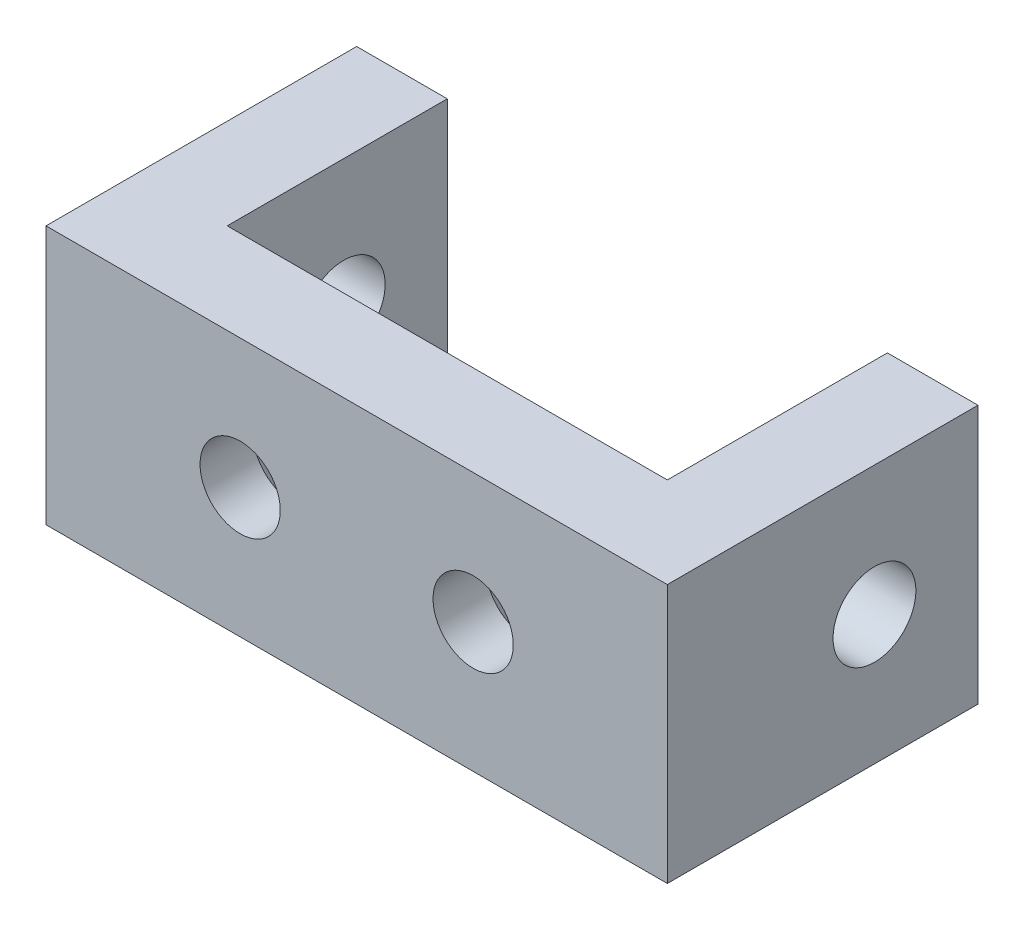
ISO-10303-21;
HEADER;
FILE_DESCRIPTION(('STEP AP214'),'2;1');
FILE_NAME('part.step','',(''),(''),'','','');
FILE_SCHEMA(('AUTOMOTIVE_DESIGN { 1 0 10303 214 1 1 1 1 }'));
ENDSEC;
DATA;
#1=APPLICATION_CONTEXT('core data for automotive mechanical design processes');
#2=APPLICATION_PROTOCOL_DEFINITION('international standard','automotive_design',2000,#1);
#3=PRODUCT_CONTEXT('',#1,'mechanical');
#4=PRODUCT('Part','Part','',(#3));
#5=PRODUCT_RELATED_PRODUCT_CATEGORY('part','',(#4));
#6=PRODUCT_DEFINITION_FORMATION('','',#4);
#7=PRODUCT_DEFINITION_CONTEXT('part definition',#1,'design');
#8=PRODUCT_DEFINITION('design','',#6,#7);
#9=PRODUCT_DEFINITION_SHAPE('','',#8);
#10=(LENGTH_UNIT() NAMED_UNIT(*) SI_UNIT(.MILLI.,.METRE.));
#11=(NAMED_UNIT(*) PLANE_ANGLE_UNIT() SI_UNIT($,.RADIAN.));
#12=(NAMED_UNIT(*) SI_UNIT($,.STERADIAN.) SOLID_ANGLE_UNIT());
#13=UNCERTAINTY_MEASURE_WITH_UNIT(LENGTH_MEASURE(1.E-05),#10,'distance_accuracy_value','');
#14=(GEOMETRIC_REPRESENTATION_CONTEXT(3) GLOBAL_UNCERTAINTY_ASSIGNED_CONTEXT((#13)) GLOBAL_UNIT_ASSIGNED_CONTEXT((#10,
#11,#12)) REPRESENTATION_CONTEXT('',''));
#15=CARTESIAN_POINT('',(0.,0.,0.));
#16=DIRECTION('',(0.,0.,1.));
#17=DIRECTION('',(1.,0.,0.));
#18=AXIS2_PLACEMENT_3D('',#15,#16,#17);
#19=CARTESIAN_POINT('',(-12.,10.,0.));
#20=DIRECTION('',(-1.,0.,0.));
#21=DIRECTION('',(0.,0.,1.));
#22=AXIS2_PLACEMENT_3D('',#19,#20,#21);
#23=PLANE('',#22);
#24=CARTESIAN_POINT('',(-12.,5.,-6.25));
#25=DIRECTION('',(-1.,0.,0.));
#26=DIRECTION('',(0.,0.,1.));
#27=AXIS2_PLACEMENT_3D('',#24,#25,#26);
#28=CIRCLE('',#27,1.6);
#29=CARTESIAN_POINT('',(-12.,5.,-4.65));
#30=VERTEX_POINT('',#29);
#31=EDGE_CURVE('E206',#30,#30,#28,.T.);
#32=ORIENTED_EDGE('',*,*,#31,.F.);
#33=EDGE_LOOP('',(#32));
#34=FACE_BOUND('',#33,.T.);
#35=DIRECTION('',(0.,0.,-1.));
#36=VECTOR('',#35,1.);
#37=CARTESIAN_POINT('',(-12.,0.,0.));
#38=LINE('',#37,#36);
#39=CARTESIAN_POINT('',(-12.,0.,1.75));
#40=VERTEX_POINT('',#39);
#41=CARTESIAN_POINT('',(-12.,0.,-10.25));
#42=VERTEX_POINT('',#41);
#43=EDGE_CURVE('E130',#40,#42,#38,.T.);
#44=ORIENTED_EDGE('',*,*,#43,.F.);
#45=DIRECTION('',(0.,-1.,0.));
#46=VECTOR('',#45,1.);
#47=CARTESIAN_POINT('',(-12.,10.,1.75));
#48=LINE('',#47,#46);
#49=CARTESIAN_POINT('',(-12.,10.,1.75));
#50=VERTEX_POINT('',#49);
#51=EDGE_CURVE('E11',#50,#40,#48,.T.);
#52=ORIENTED_EDGE('',*,*,#51,.F.);
#53=DIRECTION('',(0.,0.,-1.));
#54=VECTOR('',#53,1.);
#55=CARTESIAN_POINT('',(-12.,10.,0.));
#56=LINE('',#55,#54);
#57=CARTESIAN_POINT('',(-12.,10.,-10.25));
#58=VERTEX_POINT('',#57);
#59=EDGE_CURVE('E150',#50,#58,#56,.T.);
#60=ORIENTED_EDGE('',*,*,#59,.T.);
#61=DIRECTION('',(0.,-1.,0.));
#62=VECTOR('',#61,1.);
#63=CARTESIAN_POINT('',(-12.,10.,-10.25));
#64=LINE('',#63,#62);
#65=EDGE_CURVE('E86',#58,#42,#64,.T.);
#66=ORIENTED_EDGE('',*,*,#65,.T.);
#67=EDGE_LOOP('',(#44,#52,#60,#66));
#68=FACE_BOUND('',#67,.T.);
#69=ADVANCED_FACE('F35',(#34,#68),#23,.T.);
#70=CARTESIAN_POINT('',(0.,10.,1.75));
#71=DIRECTION('',(0.,0.,1.));
#72=DIRECTION('',(1.,0.,0.));
#73=AXIS2_PLACEMENT_3D('',#70,#71,#72);
#74=PLANE('',#73);
#75=CARTESIAN_POINT('',(4.5,5.,1.75));
#76=DIRECTION('',(0.,0.,-1.));
#77=DIRECTION('',(-1.,0.,0.));
#78=AXIS2_PLACEMENT_3D('',#75,#76,#77);
#79=CIRCLE('',#78,1.55);
#80=CARTESIAN_POINT('',(2.95,5.,1.75));
#81=VERTEX_POINT('',#80);
#82=EDGE_CURVE('E332',#81,#81,#79,.T.);
#83=ORIENTED_EDGE('',*,*,#82,.T.);
#84=EDGE_LOOP('',(#83));
#85=FACE_BOUND('',#84,.T.);
#86=CARTESIAN_POINT('',(-4.5,5.,1.75));
#87=DIRECTION('',(0.,0.,-1.));
#88=DIRECTION('',(-1.,0.,0.));
#89=AXIS2_PLACEMENT_3D('',#86,#87,#88);
#90=CIRCLE('',#89,1.55);
#91=CARTESIAN_POINT('',(-6.05,5.,1.75));
#92=VERTEX_POINT('',#91);
#93=EDGE_CURVE('E208',#92,#92,#90,.T.);
#94=ORIENTED_EDGE('',*,*,#93,.T.);
#95=EDGE_LOOP('',(#94));
#96=FACE_BOUND('',#95,.T.);
#97=DIRECTION('',(-1.,0.,0.));
#98=VECTOR('',#97,1.);
#99=CARTESIAN_POINT('',(0.,0.,1.75));
#100=LINE('',#99,#98);
#101=CARTESIAN_POINT('',(12.,0.,1.75));
#102=VERTEX_POINT('',#101);
#103=EDGE_CURVE('E133',#102,#40,#100,.T.);
#104=ORIENTED_EDGE('',*,*,#103,.F.);
#105=DIRECTION('',(0.,-1.,0.));
#106=VECTOR('',#105,1.);
#107=CARTESIAN_POINT('',(12.,10.,1.75));
#108=LINE('',#107,#106);
#109=CARTESIAN_POINT('',(12.,10.,1.75));
#110=VERTEX_POINT('',#109);
#111=EDGE_CURVE('E44',#110,#102,#108,.T.);
#112=ORIENTED_EDGE('',*,*,#111,.F.);
#113=DIRECTION('',(-1.,0.,0.));
#114=VECTOR('',#113,1.);
#115=CARTESIAN_POINT('',(0.,10.,1.75));
#116=LINE('',#115,#114);
#117=EDGE_CURVE('E172',#110,#50,#116,.T.);
#118=ORIENTED_EDGE('',*,*,#117,.T.);
#119=ORIENTED_EDGE('',*,*,#51,.T.);
#120=EDGE_LOOP('',(#104,#112,#118,#119));
#121=FACE_BOUND('',#120,.T.);
#122=ADVANCED_FACE('F171',(#85,#96,#121),#74,.T.);
#123=CARTESIAN_POINT('',(12.,10.,0.));
#124=DIRECTION('',(-1.,0.,0.));
#125=DIRECTION('',(0.,0.,1.));
#126=AXIS2_PLACEMENT_3D('',#123,#124,#125);
#127=PLANE('',#126);
#128=CARTESIAN_POINT('',(12.,5.,-6.25));
#129=DIRECTION('',(-1.,0.,0.));
#130=DIRECTION('',(0.,0.,1.));
#131=AXIS2_PLACEMENT_3D('',#128,#129,#130);
#132=CIRCLE('',#131,1.6);
#133=CARTESIAN_POINT('',(12.,5.,-4.65));
#134=VERTEX_POINT('',#133);
#135=EDGE_CURVE('E134',#134,#134,#132,.T.);
#136=ORIENTED_EDGE('',*,*,#135,.T.);
#137=EDGE_LOOP('',(#136));
#138=FACE_BOUND('',#137,.T.);
#139=DIRECTION('',(0.,0.,-1.));
#140=VECTOR('',#139,1.);
#141=CARTESIAN_POINT('',(12.,0.,0.));
#142=LINE('',#141,#140);
#143=CARTESIAN_POINT('',(12.,0.,-10.25));
#144=VERTEX_POINT('',#143);
#145=EDGE_CURVE('E137',#102,#144,#142,.T.);
#146=ORIENTED_EDGE('',*,*,#145,.T.);
#147=DIRECTION('',(0.,-1.,0.));
#148=VECTOR('',#147,1.);
#149=CARTESIAN_POINT('',(12.,10.,-10.25));
#150=LINE('',#149,#148);
#151=CARTESIAN_POINT('',(12.,10.,-10.25));
#152=VERTEX_POINT('',#151);
#153=EDGE_CURVE('E156',#152,#144,#150,.T.);
#154=ORIENTED_EDGE('',*,*,#153,.F.);
#155=DIRECTION('',(0.,0.,-1.));
#156=VECTOR('',#155,1.);
#157=CARTESIAN_POINT('',(12.,10.,0.));
#158=LINE('',#157,#156);
#159=EDGE_CURVE('E163',#110,#152,#158,.T.);
#160=ORIENTED_EDGE('',*,*,#159,.F.);
#161=ORIENTED_EDGE('',*,*,#111,.T.);
#162=EDGE_LOOP('',(#146,#154,#160,#161));
#163=FACE_BOUND('',#162,.T.);
#164=ADVANCED_FACE('F161',(#138,#163),#127,.F.);
#165=CARTESIAN_POINT('',(0.,10.,-10.25));
#166=DIRECTION('',(0.,0.,-1.));
#167=DIRECTION('',(-1.,0.,0.));
#168=AXIS2_PLACEMENT_3D('',#165,#166,#167);
#169=PLANE('',#168);
#170=DIRECTION('',(1.,0.,0.));
#171=VECTOR('',#170,1.);
#172=CARTESIAN_POINT('',(0.,0.,-10.25));
#173=LINE('',#172,#171);
#174=CARTESIAN_POINT('',(8.5,0.,-10.25));
#175=VERTEX_POINT('',#174);
#176=EDGE_CURVE('E140',#175,#144,#173,.T.);
#177=ORIENTED_EDGE('',*,*,#176,.F.);
#178=DIRECTION('',(0.,-1.,0.));
#179=VECTOR('',#178,1.);
#180=CARTESIAN_POINT('',(8.5,10.,-10.25));
#181=LINE('',#180,#179);
#182=CARTESIAN_POINT('',(8.5,10.,-10.25));
#183=VERTEX_POINT('',#182);
#184=EDGE_CURVE('E154',#183,#175,#181,.T.);
#185=ORIENTED_EDGE('',*,*,#184,.F.);
#186=DIRECTION('',(1.,0.,0.));
#187=VECTOR('',#186,1.);
#188=CARTESIAN_POINT('',(0.,10.,-10.25));
#189=LINE('',#188,#187);
#190=EDGE_CURVE('E125',#183,#152,#189,.T.);
#191=ORIENTED_EDGE('',*,*,#190,.T.);
#192=ORIENTED_EDGE('',*,*,#153,.T.);
#193=EDGE_LOOP('',(#177,#185,#191,#192));
#194=FACE_BOUND('',#193,.T.);
#195=ADVANCED_FACE('F183',(#194),#169,.T.);
#196=CARTESIAN_POINT('',(8.5,10.,0.));
#197=DIRECTION('',(-1.,0.,0.));
#198=DIRECTION('',(0.,0.,1.));
#199=AXIS2_PLACEMENT_3D('',#196,#197,#198);
#200=PLANE('',#199);
#201=CARTESIAN_POINT('',(8.5,5.,-6.25));
#202=DIRECTION('',(-1.,0.,0.));
#203=DIRECTION('',(0.,0.,1.));
#204=AXIS2_PLACEMENT_3D('',#201,#202,#203);
#205=CIRCLE('',#204,1.6);
#206=CARTESIAN_POINT('',(8.5,5.,-4.65));
#207=VERTEX_POINT('',#206);
#208=EDGE_CURVE('E211',#207,#207,#205,.T.);
#209=ORIENTED_EDGE('',*,*,#208,.F.);
#210=EDGE_LOOP('',(#209));
#211=FACE_BOUND('',#210,.T.);
#212=DIRECTION('',(0.,0.,-1.));
#213=VECTOR('',#212,1.);
#214=CARTESIAN_POINT('',(8.5,0.,0.));
#215=LINE('',#214,#213);
#216=CARTESIAN_POINT('',(8.5,0.,-1.75));
#217=VERTEX_POINT('',#216);
#218=EDGE_CURVE('E143',#217,#175,#215,.T.);
#219=ORIENTED_EDGE('',*,*,#218,.F.);
#220=DIRECTION('',(0.,-1.,0.));
#221=VECTOR('',#220,1.);
#222=CARTESIAN_POINT('',(8.5,10.,-1.75));
#223=LINE('',#222,#221);
#224=CARTESIAN_POINT('',(8.5,10.,-1.75));
#225=VERTEX_POINT('',#224);
#226=EDGE_CURVE('E113',#225,#217,#223,.T.);
#227=ORIENTED_EDGE('',*,*,#226,.F.);
#228=DIRECTION('',(0.,0.,-1.));
#229=VECTOR('',#228,1.);
#230=CARTESIAN_POINT('',(8.5,10.,0.));
#231=LINE('',#230,#229);
#232=EDGE_CURVE('E123',#225,#183,#231,.T.);
#233=ORIENTED_EDGE('',*,*,#232,.T.);
#234=ORIENTED_EDGE('',*,*,#184,.T.);
#235=EDGE_LOOP('',(#219,#227,#233,#234));
#236=FACE_BOUND('',#235,.T.);
#237=ADVANCED_FACE('F186',(#211,#236),#200,.T.);
#238=CARTESIAN_POINT('',(0.,10.,-1.75));
#239=DIRECTION('',(0.,0.,-1.));
#240=DIRECTION('',(-1.,0.,0.));
#241=AXIS2_PLACEMENT_3D('',#238,#239,#240);
#242=PLANE('',#241);
#243=CARTESIAN_POINT('',(4.5,5.,-1.75));
#244=DIRECTION('',(0.,0.,-1.));
#245=DIRECTION('',(-1.,0.,0.));
#246=AXIS2_PLACEMENT_3D('',#243,#244,#245);
#247=CIRCLE('',#246,3.);
#248=CARTESIAN_POINT('',(1.5,5.,-1.75));
#249=VERTEX_POINT('',#248);
#250=EDGE_CURVE('E330',#249,#249,#247,.T.);
#251=ORIENTED_EDGE('',*,*,#250,.F.);
#252=EDGE_LOOP('',(#251));
#253=FACE_BOUND('',#252,.T.);
#254=CARTESIAN_POINT('',(-4.5,5.,-1.75));
#255=DIRECTION('',(0.,0.,-1.));
#256=DIRECTION('',(-1.,0.,0.));
#257=AXIS2_PLACEMENT_3D('',#254,#255,#256);
#258=CIRCLE('',#257,3.);
#259=CARTESIAN_POINT('',(-7.5,5.,-1.75));
#260=VERTEX_POINT('',#259);
#261=EDGE_CURVE('E337',#260,#260,#258,.T.);
#262=ORIENTED_EDGE('',*,*,#261,.F.);
#263=EDGE_LOOP('',(#262));
#264=FACE_BOUND('',#263,.T.);
#265=DIRECTION('',(1.,0.,0.));
#266=VECTOR('',#265,1.);
#267=CARTESIAN_POINT('',(0.,0.,-1.75));
#268=LINE('',#267,#266);
#269=CARTESIAN_POINT('',(-8.5,0.,-1.75));
#270=VERTEX_POINT('',#269);
#271=EDGE_CURVE('E112',#270,#217,#268,.T.);
#272=ORIENTED_EDGE('',*,*,#271,.F.);
#273=DIRECTION('',(0.,-1.,0.));
#274=VECTOR('',#273,1.);
#275=CARTESIAN_POINT('',(-8.5,10.,-1.75));
#276=LINE('',#275,#274);
#277=CARTESIAN_POINT('',(-8.5,10.,-1.75));
#278=VERTEX_POINT('',#277);
#279=EDGE_CURVE('E106',#278,#270,#276,.T.);
#280=ORIENTED_EDGE('',*,*,#279,.F.);
#281=DIRECTION('',(1.,0.,0.));
#282=VECTOR('',#281,1.);
#283=CARTESIAN_POINT('',(0.,10.,-1.75));
#284=LINE('',#283,#282);
#285=EDGE_CURVE('E110',#278,#225,#284,.T.);
#286=ORIENTED_EDGE('',*,*,#285,.T.);
#287=ORIENTED_EDGE('',*,*,#226,.T.);
#288=EDGE_LOOP('',(#272,#280,#286,#287));
#289=FACE_BOUND('',#288,.T.);
#290=ADVANCED_FACE('F108',(#253,#264,#289),#242,.T.);
#291=CARTESIAN_POINT('',(-8.5,10.,0.));
#292=DIRECTION('',(-1.,0.,0.));
#293=DIRECTION('',(0.,0.,1.));
#294=AXIS2_PLACEMENT_3D('',#291,#292,#293);
#295=PLANE('',#294);
#296=CARTESIAN_POINT('',(-8.5,5.,-6.25));
#297=DIRECTION('',(-1.,0.,0.));
#298=DIRECTION('',(0.,0.,1.));
#299=AXIS2_PLACEMENT_3D('',#296,#297,#298);
#300=CIRCLE('',#299,1.6);
#301=CARTESIAN_POINT('',(-8.5,5.,-4.65));
#302=VERTEX_POINT('',#301);
#303=EDGE_CURVE('E38',#302,#302,#300,.T.);
#304=ORIENTED_EDGE('',*,*,#303,.T.);
#305=EDGE_LOOP('',(#304));
#306=FACE_BOUND('',#305,.T.);
#307=DIRECTION('',(0.,0.,-1.));
#308=VECTOR('',#307,1.);
#309=CARTESIAN_POINT('',(-8.5,0.,0.));
#310=LINE('',#309,#308);
#311=CARTESIAN_POINT('',(-8.5,0.,-10.25));
#312=VERTEX_POINT('',#311);
#313=EDGE_CURVE('E79',#270,#312,#310,.T.);
#314=ORIENTED_EDGE('',*,*,#313,.T.);
#315=DIRECTION('',(0.,-1.,0.));
#316=VECTOR('',#315,1.);
#317=CARTESIAN_POINT('',(-8.5,10.,-10.25));
#318=LINE('',#317,#316);
#319=CARTESIAN_POINT('',(-8.5,10.,-10.25));
#320=VERTEX_POINT('',#319);
#321=EDGE_CURVE('E114',#320,#312,#318,.T.);
#322=ORIENTED_EDGE('',*,*,#321,.F.);
#323=DIRECTION('',(0.,0.,-1.));
#324=VECTOR('',#323,1.);
#325=CARTESIAN_POINT('',(-8.5,10.,0.));
#326=LINE('',#325,#324);
#327=EDGE_CURVE('E116',#278,#320,#326,.T.);
#328=ORIENTED_EDGE('',*,*,#327,.F.);
#329=ORIENTED_EDGE('',*,*,#279,.T.);
#330=EDGE_LOOP('',(#314,#322,#328,#329));
#331=FACE_BOUND('',#330,.T.);
#332=ADVANCED_FACE('F117',(#306,#331),#295,.F.);
#333=CARTESIAN_POINT('',(0.,10.,-10.25));
#334=DIRECTION('',(0.,0.,1.));
#335=DIRECTION('',(1.,0.,0.));
#336=AXIS2_PLACEMENT_3D('',#333,#334,#335);
#337=PLANE('',#336);
#338=DIRECTION('',(-1.,0.,0.));
#339=VECTOR('',#338,1.);
#340=CARTESIAN_POINT('',(0.,0.,-10.25));
#341=LINE('',#340,#339);
#342=EDGE_CURVE('E148',#312,#42,#341,.T.);
#343=ORIENTED_EDGE('',*,*,#342,.T.);
#344=ORIENTED_EDGE('',*,*,#65,.F.);
#345=DIRECTION('',(-1.,0.,0.));
#346=VECTOR('',#345,1.);
#347=CARTESIAN_POINT('',(0.,10.,-10.25));
#348=LINE('',#347,#346);
#349=EDGE_CURVE('E52',#320,#58,#348,.T.);
#350=ORIENTED_EDGE('',*,*,#349,.F.);
#351=ORIENTED_EDGE('',*,*,#321,.T.);
#352=EDGE_LOOP('',(#343,#344,#350,#351));
#353=FACE_BOUND('',#352,.T.);
#354=ADVANCED_FACE('F175',(#353),#337,.F.);
#355=CARTESIAN_POINT('',(0.,10.,0.));
#356=DIRECTION('',(0.,1.,0.));
#357=DIRECTION('',(0.,0.,1.));
#358=AXIS2_PLACEMENT_3D('',#355,#356,#357);
#359=PLANE('',#358);
#360=ORIENTED_EDGE('',*,*,#59,.F.);
#361=ORIENTED_EDGE('',*,*,#117,.F.);
#362=ORIENTED_EDGE('',*,*,#159,.T.);
#363=ORIENTED_EDGE('',*,*,#190,.F.);
#364=ORIENTED_EDGE('',*,*,#232,.F.);
#365=ORIENTED_EDGE('',*,*,#285,.F.);
#366=ORIENTED_EDGE('',*,*,#327,.T.);
#367=ORIENTED_EDGE('',*,*,#349,.T.);
#368=EDGE_LOOP('',(#360,#361,#362,#363,#364,#365,#366,#367));
#369=FACE_BOUND('',#368,.T.);
#370=ADVANCED_FACE('F120',(#369),#359,.T.);
#371=CARTESIAN_POINT('',(0.,0.,0.));
#372=DIRECTION('',(0.,1.,0.));
#373=DIRECTION('',(0.,0.,1.));
#374=AXIS2_PLACEMENT_3D('',#371,#372,#373);
#375=PLANE('',#374);
#376=ORIENTED_EDGE('',*,*,#43,.T.);
#377=ORIENTED_EDGE('',*,*,#342,.F.);
#378=ORIENTED_EDGE('',*,*,#313,.F.);
#379=ORIENTED_EDGE('',*,*,#271,.T.);
#380=ORIENTED_EDGE('',*,*,#218,.T.);
#381=ORIENTED_EDGE('',*,*,#176,.T.);
#382=ORIENTED_EDGE('',*,*,#145,.F.);
#383=ORIENTED_EDGE('',*,*,#103,.T.);
#384=EDGE_LOOP('',(#376,#377,#378,#379,#380,#381,#382,#383));
#385=FACE_BOUND('',#384,.T.);
#386=ADVANCED_FACE('F169',(#385),#375,.F.);
#387=CARTESIAN_POINT('',(12.5,5.,-6.25));
#388=DIRECTION('',(-1.,0.,0.));
#389=DIRECTION('',(0.,0.,1.));
#390=AXIS2_PLACEMENT_3D('',#387,#388,#389);
#391=CYLINDRICAL_SURFACE('',#390,1.6);
#392=ORIENTED_EDGE('',*,*,#31,.T.);
#393=EDGE_LOOP('',(#392));
#394=FACE_BOUND('',#393,.T.);
#395=ORIENTED_EDGE('',*,*,#303,.F.);
#396=EDGE_LOOP('',(#395));
#397=FACE_BOUND('',#396,.T.);
#398=ADVANCED_FACE('F225',(#394,#397),#391,.F.);
#399=ORIENTED_EDGE('',*,*,#208,.T.);
#400=EDGE_LOOP('',(#399));
#401=FACE_BOUND('',#400,.T.);
#402=ORIENTED_EDGE('',*,*,#135,.F.);
#403=EDGE_LOOP('',(#402));
#404=FACE_BOUND('',#403,.T.);
#405=ADVANCED_FACE('F222',(#401,#404),#391,.F.);
#406=CARTESIAN_POINT('',(-4.5,5.,-1.75));
#407=DIRECTION('',(0.,0.,-1.));
#408=DIRECTION('',(-1.,0.,0.));
#409=AXIS2_PLACEMENT_3D('',#406,#407,#408);
#410=CYLINDRICAL_SURFACE('',#409,1.55);
#411=ORIENTED_EDGE('',*,*,#93,.F.);
#412=EDGE_LOOP('',(#411));
#413=FACE_BOUND('',#412,.T.);
#414=CARTESIAN_POINT('',(-4.5,5.,-0.300000000000001));
#415=DIRECTION('',(0.,0.,-1.));
#416=DIRECTION('',(-1.,0.,0.));
#417=AXIS2_PLACEMENT_3D('',#414,#415,#416);
#418=CIRCLE('',#417,1.55);
#419=CARTESIAN_POINT('',(-6.05,5.,-0.300000000000001));
#420=VERTEX_POINT('',#419);
#421=EDGE_CURVE('E213',#420,#420,#418,.T.);
#422=ORIENTED_EDGE('',*,*,#421,.T.);
#423=EDGE_LOOP('',(#422));
#424=FACE_BOUND('',#423,.T.);
#425=ADVANCED_FACE('F224',(#413,#424),#410,.F.);
#426=CARTESIAN_POINT('',(-4.5,5.,-1.75));
#427=DIRECTION('',(0.,0.,-1.));
#428=DIRECTION('',(-1.,0.,0.));
#429=AXIS2_PLACEMENT_3D('',#426,#427,#428);
#430=CONICAL_SURFACE('',#429,3.,0.785398163397449);
#431=ORIENTED_EDGE('',*,*,#421,.F.);
#432=EDGE_LOOP('',(#431));
#433=FACE_BOUND('',#432,.T.);
#434=ORIENTED_EDGE('',*,*,#261,.T.);
#435=EDGE_LOOP('',(#434));
#436=FACE_BOUND('',#435,.T.);
#437=ADVANCED_FACE('F231',(#433,#436),#430,.F.);
#438=CARTESIAN_POINT('',(4.5,5.,-1.75));
#439=DIRECTION('',(0.,0.,-1.));
#440=DIRECTION('',(-1.,0.,0.));
#441=AXIS2_PLACEMENT_3D('',#438,#439,#440);
#442=CYLINDRICAL_SURFACE('',#441,1.55);
#443=ORIENTED_EDGE('',*,*,#82,.F.);
#444=EDGE_LOOP('',(#443));
#445=FACE_BOUND('',#444,.T.);
#446=CARTESIAN_POINT('',(4.5,5.,-0.300000000000002));
#447=DIRECTION('',(0.,0.,-1.));
#448=DIRECTION('',(-1.,0.,0.));
#449=AXIS2_PLACEMENT_3D('',#446,#447,#448);
#450=CIRCLE('',#449,1.55);
#451=CARTESIAN_POINT('',(2.95,5.,-0.300000000000002));
#452=VERTEX_POINT('',#451);
#453=EDGE_CURVE('E327',#452,#452,#450,.T.);
#454=ORIENTED_EDGE('',*,*,#453,.T.);
#455=EDGE_LOOP('',(#454));
#456=FACE_BOUND('',#455,.T.);
#457=ADVANCED_FACE('F301',(#445,#456),#442,.F.);
#458=CARTESIAN_POINT('',(4.5,5.,-1.75));
#459=DIRECTION('',(0.,0.,-1.));
#460=DIRECTION('',(-1.,0.,0.));
#461=AXIS2_PLACEMENT_3D('',#458,#459,#460);
#462=CONICAL_SURFACE('',#461,3.,0.785398163397449);
#463=ORIENTED_EDGE('',*,*,#453,.F.);
#464=EDGE_LOOP('',(#463));
#465=FACE_BOUND('',#464,.T.);
#466=ORIENTED_EDGE('',*,*,#250,.T.);
#467=EDGE_LOOP('',(#466));
#468=FACE_BOUND('',#467,.T.);
#469=ADVANCED_FACE('F310',(#465,#468),#462,.F.);
#470=CLOSED_SHELL('',(#69,#122,#164,#195,#237,#290,#332,#354,#370,#386,#398,#405,#425,#437,#457,#469));
#471=MANIFOLD_SOLID_BREP('B2',#470);
#472=ADVANCED_BREP_SHAPE_REPRESENTATION('',(#18,#471),#14);
#473=SHAPE_DEFINITION_REPRESENTATION(#9,#472);
ENDSEC;
END-ISO-10303-21;
